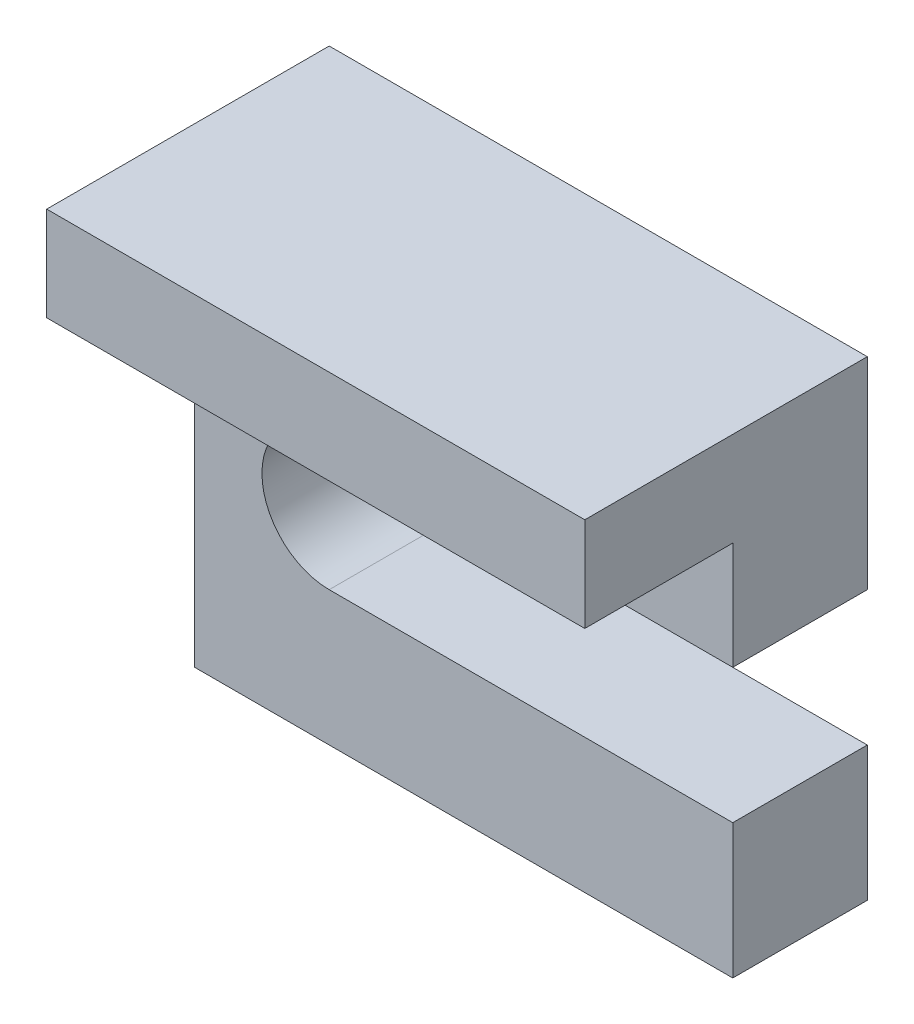
ISO-10303-21;
HEADER;
FILE_DESCRIPTION(('STEP AP214'),'2;1');
FILE_NAME('part.step','',(''),(''),'','','');
FILE_SCHEMA(('AUTOMOTIVE_DESIGN { 1 0 10303 214 1 1 1 1 }'));
ENDSEC;
DATA;
#1=APPLICATION_CONTEXT('core data for automotive mechanical design processes');
#2=APPLICATION_PROTOCOL_DEFINITION('international standard','automotive_design',2000,#1);
#3=PRODUCT_CONTEXT('',#1,'mechanical');
#4=PRODUCT('Part','Part','',(#3));
#5=PRODUCT_RELATED_PRODUCT_CATEGORY('part','',(#4));
#6=PRODUCT_DEFINITION_FORMATION('','',#4);
#7=PRODUCT_DEFINITION_CONTEXT('part definition',#1,'design');
#8=PRODUCT_DEFINITION('design','',#6,#7);
#9=PRODUCT_DEFINITION_SHAPE('','',#8);
#10=(LENGTH_UNIT() NAMED_UNIT(*) SI_UNIT(.MILLI.,.METRE.));
#11=(NAMED_UNIT(*) PLANE_ANGLE_UNIT() SI_UNIT($,.RADIAN.));
#12=(NAMED_UNIT(*) SI_UNIT($,.STERADIAN.) SOLID_ANGLE_UNIT());
#13=UNCERTAINTY_MEASURE_WITH_UNIT(LENGTH_MEASURE(1.E-05),#10,'distance_accuracy_value','');
#14=(GEOMETRIC_REPRESENTATION_CONTEXT(3) GLOBAL_UNCERTAINTY_ASSIGNED_CONTEXT((#13)) GLOBAL_UNIT_ASSIGNED_CONTEXT((#10,
#11,#12)) REPRESENTATION_CONTEXT('',''));
#15=CARTESIAN_POINT('',(0.,0.,0.));
#16=DIRECTION('',(0.,0.,1.));
#17=DIRECTION('',(1.,0.,0.));
#18=AXIS2_PLACEMENT_3D('',#15,#16,#17);
#19=CARTESIAN_POINT('',(-20.,17.5,-5.));
#20=DIRECTION('',(0.,0.,-1.));
#21=DIRECTION('',(0.,1.,0.));
#22=AXIS2_PLACEMENT_3D('',#19,#20,#21);
#23=PLANE('',#22);
#24=CARTESIAN_POINT('',(-10.,-2.5,-5.));
#25=DIRECTION('',(0.,0.,1.));
#26=DIRECTION('',(1.,0.,0.));
#27=AXIS2_PLACEMENT_3D('',#24,#25,#26);
#28=CIRCLE('',#27,5.);
#29=CARTESIAN_POINT('',(-10.,2.5,-5.));
#30=VERTEX_POINT('',#29);
#31=CARTESIAN_POINT('',(-10.,-7.5,-5.));
#32=VERTEX_POINT('',#31);
#33=EDGE_CURVE('E120',#30,#32,#28,.T.);
#34=ORIENTED_EDGE('',*,*,#33,.T.);
#35=DIRECTION('',(-1.,0.,0.));
#36=VECTOR('',#35,1.);
#37=CARTESIAN_POINT('',(0.,-7.5,-5.));
#38=LINE('',#37,#36);
#39=CARTESIAN_POINT('',(20.,-7.5,-5.));
#40=VERTEX_POINT('',#39);
#41=EDGE_CURVE('E112',#40,#32,#38,.T.);
#42=ORIENTED_EDGE('',*,*,#41,.F.);
#43=DIRECTION('',(0.,1.,0.));
#44=VECTOR('',#43,1.);
#45=CARTESIAN_POINT('',(20.,17.5,-5.));
#46=LINE('',#45,#44);
#47=CARTESIAN_POINT('',(20.,-17.5,-5.));
#48=VERTEX_POINT('',#47);
#49=EDGE_CURVE('E125',#48,#40,#46,.T.);
#50=ORIENTED_EDGE('',*,*,#49,.F.);
#51=DIRECTION('',(1.,0.,0.));
#52=VECTOR('',#51,1.);
#53=CARTESIAN_POINT('',(-20.,-17.5,-5.));
#54=LINE('',#53,#52);
#55=CARTESIAN_POINT('',(-20.,-17.5,-5.));
#56=VERTEX_POINT('',#55);
#57=EDGE_CURVE('E162',#56,#48,#54,.T.);
#58=ORIENTED_EDGE('',*,*,#57,.F.);
#59=DIRECTION('',(0.,1.,0.));
#60=VECTOR('',#59,1.);
#61=CARTESIAN_POINT('',(-20.,17.5,-5.));
#62=LINE('',#61,#60);
#63=CARTESIAN_POINT('',(-20.,17.5,-5.));
#64=VERTEX_POINT('',#63);
#65=EDGE_CURVE('E151',#56,#64,#62,.T.);
#66=ORIENTED_EDGE('',*,*,#65,.T.);
#67=DIRECTION('',(1.,0.,0.));
#68=VECTOR('',#67,1.);
#69=CARTESIAN_POINT('',(-20.,17.5,-5.));
#70=LINE('',#69,#68);
#71=CARTESIAN_POINT('',(20.,17.5,-5.));
#72=VERTEX_POINT('',#71);
#73=EDGE_CURVE('E159',#64,#72,#70,.T.);
#74=ORIENTED_EDGE('',*,*,#73,.T.);
#75=CARTESIAN_POINT('',(20.,2.5,-5.));
#76=VERTEX_POINT('',#75);
#77=EDGE_CURVE('E133',#76,#72,#46,.T.);
#78=ORIENTED_EDGE('',*,*,#77,.F.);
#79=DIRECTION('',(1.,0.,0.));
#80=VECTOR('',#79,1.);
#81=CARTESIAN_POINT('',(0.,2.5,-5.));
#82=LINE('',#81,#80);
#83=EDGE_CURVE('E48',#30,#76,#82,.T.);
#84=ORIENTED_EDGE('',*,*,#83,.F.);
#85=EDGE_LOOP('',(#34,#42,#50,#58,#66,#74,#78,#84));
#86=FACE_BOUND('',#85,.T.);
#87=ADVANCED_FACE('F33',(#86),#23,.T.);
#88=CARTESIAN_POINT('',(-20.,-17.5,5.));
#89=DIRECTION('',(0.,0.,1.));
#90=DIRECTION('',(1.,0.,0.));
#91=AXIS2_PLACEMENT_3D('',#88,#89,#90);
#92=PLANE('',#91);
#93=DIRECTION('',(0.,-1.,0.));
#94=VECTOR('',#93,1.);
#95=CARTESIAN_POINT('',(20.,-17.5,5.));
#96=LINE('',#95,#94);
#97=CARTESIAN_POINT('',(20.,-7.5,5.));
#98=VERTEX_POINT('',#97);
#99=CARTESIAN_POINT('',(20.,-17.5,5.));
#100=VERTEX_POINT('',#99);
#101=EDGE_CURVE('E179',#98,#100,#96,.T.);
#102=ORIENTED_EDGE('',*,*,#101,.F.);
#103=DIRECTION('',(-1.,0.,0.));
#104=VECTOR('',#103,1.);
#105=CARTESIAN_POINT('',(-20.,-7.50000000000001,5.));
#106=LINE('',#105,#104);
#107=CARTESIAN_POINT('',(-10.,-7.5,5.));
#108=VERTEX_POINT('',#107);
#109=EDGE_CURVE('E115',#98,#108,#106,.T.);
#110=ORIENTED_EDGE('',*,*,#109,.T.);
#111=CARTESIAN_POINT('',(-10.,-2.5,5.));
#112=DIRECTION('',(0.,0.,1.));
#113=DIRECTION('',(1.,0.,0.));
#114=AXIS2_PLACEMENT_3D('',#111,#112,#113);
#115=CIRCLE('',#114,5.);
#116=CARTESIAN_POINT('',(-10.,2.5,5.));
#117=VERTEX_POINT('',#116);
#118=EDGE_CURVE('E11',#117,#108,#115,.T.);
#119=ORIENTED_EDGE('',*,*,#118,.F.);
#120=DIRECTION('',(1.,0.,0.));
#121=VECTOR('',#120,1.);
#122=CARTESIAN_POINT('',(-20.,2.5,5.));
#123=LINE('',#122,#121);
#124=CARTESIAN_POINT('',(20.,2.49999999999999,5.));
#125=VERTEX_POINT('',#124);
#126=EDGE_CURVE('E184',#117,#125,#123,.T.);
#127=ORIENTED_EDGE('',*,*,#126,.T.);
#128=CARTESIAN_POINT('',(20.,10.5,5.));
#129=VERTEX_POINT('',#128);
#130=EDGE_CURVE('E187',#129,#125,#96,.T.);
#131=ORIENTED_EDGE('',*,*,#130,.F.);
#132=DIRECTION('',(1.,0.,0.));
#133=VECTOR('',#132,1.);
#134=CARTESIAN_POINT('',(-20.,10.5,5.));
#135=LINE('',#134,#133);
#136=CARTESIAN_POINT('',(-20.,10.5,5.));
#137=VERTEX_POINT('',#136);
#138=EDGE_CURVE('E167',#137,#129,#135,.T.);
#139=ORIENTED_EDGE('',*,*,#138,.F.);
#140=DIRECTION('',(0.,-1.,0.));
#141=VECTOR('',#140,1.);
#142=CARTESIAN_POINT('',(-20.,-17.5,5.));
#143=LINE('',#142,#141);
#144=CARTESIAN_POINT('',(-20.,-17.5,5.));
#145=VERTEX_POINT('',#144);
#146=EDGE_CURVE('E145',#137,#145,#143,.T.);
#147=ORIENTED_EDGE('',*,*,#146,.T.);
#148=DIRECTION('',(1.,0.,0.));
#149=VECTOR('',#148,1.);
#150=CARTESIAN_POINT('',(-20.,-17.5,5.));
#151=LINE('',#150,#149);
#152=EDGE_CURVE('E164',#145,#100,#151,.T.);
#153=ORIENTED_EDGE('',*,*,#152,.T.);
#154=EDGE_LOOP('',(#102,#110,#119,#127,#131,#139,#147,#153));
#155=FACE_BOUND('',#154,.T.);
#156=ADVANCED_FACE('F189',(#155),#92,.T.);
#157=CARTESIAN_POINT('',(20.,0.,0.));
#158=DIRECTION('',(-1.,0.,0.));
#159=DIRECTION('',(0.,0.,1.));
#160=AXIS2_PLACEMENT_3D('',#157,#158,#159);
#161=PLANE('',#160);
#162=DIRECTION('',(0.,0.,1.));
#163=VECTOR('',#162,1.);
#164=CARTESIAN_POINT('',(20.,-7.5,-5.));
#165=LINE('',#164,#163);
#166=EDGE_CURVE('E108',#40,#98,#165,.T.);
#167=ORIENTED_EDGE('',*,*,#166,.T.);
#168=ORIENTED_EDGE('',*,*,#101,.T.);
#169=DIRECTION('',(0.,0.,-1.));
#170=VECTOR('',#169,1.);
#171=CARTESIAN_POINT('',(20.,-17.5,-5.));
#172=LINE('',#171,#170);
#173=EDGE_CURVE('E131',#100,#48,#172,.T.);
#174=ORIENTED_EDGE('',*,*,#173,.T.);
#175=ORIENTED_EDGE('',*,*,#49,.T.);
#176=EDGE_LOOP('',(#167,#168,#174,#175));
#177=FACE_BOUND('',#176,.T.);
#178=ADVANCED_FACE('F129',(#177),#161,.F.);
#179=DIRECTION('',(0.,0.,1.));
#180=VECTOR('',#179,1.);
#181=CARTESIAN_POINT('',(20.,2.49999999999999,-5.));
#182=LINE('',#181,#180);
#183=EDGE_CURVE('E119',#76,#125,#182,.T.);
#184=ORIENTED_EDGE('',*,*,#183,.F.);
#185=ORIENTED_EDGE('',*,*,#77,.T.);
#186=DIRECTION('',(0.,0.,1.));
#187=VECTOR('',#186,1.);
#188=CARTESIAN_POINT('',(20.,17.5,16.));
#189=LINE('',#188,#187);
#190=CARTESIAN_POINT('',(20.,17.5,16.));
#191=VERTEX_POINT('',#190);
#192=EDGE_CURVE('E132',#72,#191,#189,.T.);
#193=ORIENTED_EDGE('',*,*,#192,.T.);
#194=DIRECTION('',(0.,-1.,0.));
#195=VECTOR('',#194,1.);
#196=CARTESIAN_POINT('',(20.,10.5,16.));
#197=LINE('',#196,#195);
#198=CARTESIAN_POINT('',(20.,10.5,16.));
#199=VERTEX_POINT('',#198);
#200=EDGE_CURVE('E170',#191,#199,#197,.T.);
#201=ORIENTED_EDGE('',*,*,#200,.T.);
#202=DIRECTION('',(0.,0.,-1.));
#203=VECTOR('',#202,1.);
#204=CARTESIAN_POINT('',(20.,10.5,5.));
#205=LINE('',#204,#203);
#206=EDGE_CURVE('E174',#199,#129,#205,.T.);
#207=ORIENTED_EDGE('',*,*,#206,.T.);
#208=ORIENTED_EDGE('',*,*,#130,.T.);
#209=EDGE_LOOP('',(#184,#185,#193,#201,#207,#208));
#210=FACE_BOUND('',#209,.T.);
#211=ADVANCED_FACE('F181',(#210),#161,.F.);
#212=CARTESIAN_POINT('',(-20.,10.5,16.));
#213=DIRECTION('',(0.,0.,1.));
#214=DIRECTION('',(1.,0.,0.));
#215=AXIS2_PLACEMENT_3D('',#212,#213,#214);
#216=PLANE('',#215);
#217=DIRECTION('',(1.,0.,0.));
#218=VECTOR('',#217,1.);
#219=CARTESIAN_POINT('',(-20.,10.5,16.));
#220=LINE('',#219,#218);
#221=CARTESIAN_POINT('',(-20.,10.5,16.));
#222=VERTEX_POINT('',#221);
#223=EDGE_CURVE('E157',#222,#199,#220,.T.);
#224=ORIENTED_EDGE('',*,*,#223,.T.);
#225=ORIENTED_EDGE('',*,*,#200,.F.);
#226=DIRECTION('',(1.,0.,0.));
#227=VECTOR('',#226,1.);
#228=CARTESIAN_POINT('',(-20.,17.5,16.));
#229=LINE('',#228,#227);
#230=CARTESIAN_POINT('',(-20.,17.5,16.));
#231=VERTEX_POINT('',#230);
#232=EDGE_CURVE('E41',#231,#191,#229,.T.);
#233=ORIENTED_EDGE('',*,*,#232,.F.);
#234=DIRECTION('',(0.,-1.,0.));
#235=VECTOR('',#234,1.);
#236=CARTESIAN_POINT('',(-20.,10.5,16.));
#237=LINE('',#236,#235);
#238=EDGE_CURVE('E136',#231,#222,#237,.T.);
#239=ORIENTED_EDGE('',*,*,#238,.T.);
#240=EDGE_LOOP('',(#224,#225,#233,#239));
#241=FACE_BOUND('',#240,.T.);
#242=ADVANCED_FACE('F35',(#241),#216,.T.);
#243=CARTESIAN_POINT('',(-20.,17.5,16.));
#244=DIRECTION('',(0.,1.,0.));
#245=DIRECTION('',(0.,0.,1.));
#246=AXIS2_PLACEMENT_3D('',#243,#244,#245);
#247=PLANE('',#246);
#248=ORIENTED_EDGE('',*,*,#232,.T.);
#249=ORIENTED_EDGE('',*,*,#192,.F.);
#250=ORIENTED_EDGE('',*,*,#73,.F.);
#251=DIRECTION('',(0.,0.,1.));
#252=VECTOR('',#251,1.);
#253=CARTESIAN_POINT('',(-20.,17.5,16.));
#254=LINE('',#253,#252);
#255=EDGE_CURVE('E154',#64,#231,#254,.T.);
#256=ORIENTED_EDGE('',*,*,#255,.T.);
#257=EDGE_LOOP('',(#248,#249,#250,#256));
#258=FACE_BOUND('',#257,.T.);
#259=ADVANCED_FACE('F199',(#258),#247,.T.);
#260=CARTESIAN_POINT('',(-20.,-17.5,-5.));
#261=DIRECTION('',(0.,-1.,0.));
#262=DIRECTION('',(0.,0.,-1.));
#263=AXIS2_PLACEMENT_3D('',#260,#261,#262);
#264=PLANE('',#263);
#265=ORIENTED_EDGE('',*,*,#57,.T.);
#266=ORIENTED_EDGE('',*,*,#173,.F.);
#267=ORIENTED_EDGE('',*,*,#152,.F.);
#268=DIRECTION('',(0.,0.,-1.));
#269=VECTOR('',#268,1.);
#270=CARTESIAN_POINT('',(-20.,-17.5,-5.));
#271=LINE('',#270,#269);
#272=EDGE_CURVE('E148',#145,#56,#271,.T.);
#273=ORIENTED_EDGE('',*,*,#272,.T.);
#274=EDGE_LOOP('',(#265,#266,#267,#273));
#275=FACE_BOUND('',#274,.T.);
#276=ADVANCED_FACE('F193',(#275),#264,.T.);
#277=CARTESIAN_POINT('',(-20.,10.5,5.));
#278=DIRECTION('',(0.,-1.,0.));
#279=DIRECTION('',(0.,0.,-1.));
#280=AXIS2_PLACEMENT_3D('',#277,#278,#279);
#281=PLANE('',#280);
#282=ORIENTED_EDGE('',*,*,#138,.T.);
#283=ORIENTED_EDGE('',*,*,#206,.F.);
#284=ORIENTED_EDGE('',*,*,#223,.F.);
#285=DIRECTION('',(0.,0.,-1.));
#286=VECTOR('',#285,1.);
#287=CARTESIAN_POINT('',(-20.,10.5,5.));
#288=LINE('',#287,#286);
#289=EDGE_CURVE('E142',#222,#137,#288,.T.);
#290=ORIENTED_EDGE('',*,*,#289,.T.);
#291=EDGE_LOOP('',(#282,#283,#284,#290));
#292=FACE_BOUND('',#291,.T.);
#293=ADVANCED_FACE('F175',(#292),#281,.T.);
#294=CARTESIAN_POINT('',(-20.,0.,0.));
#295=DIRECTION('',(-1.,0.,0.));
#296=DIRECTION('',(0.,0.,1.));
#297=AXIS2_PLACEMENT_3D('',#294,#295,#296);
#298=PLANE('',#297);
#299=ORIENTED_EDGE('',*,*,#238,.F.);
#300=ORIENTED_EDGE('',*,*,#255,.F.);
#301=ORIENTED_EDGE('',*,*,#65,.F.);
#302=ORIENTED_EDGE('',*,*,#272,.F.);
#303=ORIENTED_EDGE('',*,*,#146,.F.);
#304=ORIENTED_EDGE('',*,*,#289,.F.);
#305=EDGE_LOOP('',(#299,#300,#301,#302,#303,#304));
#306=FACE_BOUND('',#305,.T.);
#307=ADVANCED_FACE('F197',(#306),#298,.T.);
#308=CARTESIAN_POINT('',(0.,-7.5,-5.));
#309=DIRECTION('',(0.,1.,0.));
#310=DIRECTION('',(-1.,0.,0.));
#311=AXIS2_PLACEMENT_3D('',#308,#309,#310);
#312=PLANE('',#311);
#313=ORIENTED_EDGE('',*,*,#166,.F.);
#314=ORIENTED_EDGE('',*,*,#41,.T.);
#315=DIRECTION('',(0.,0.,1.));
#316=VECTOR('',#315,1.);
#317=CARTESIAN_POINT('',(-10.,-7.5,-5.));
#318=LINE('',#317,#316);
#319=EDGE_CURVE('E205',#32,#108,#318,.T.);
#320=ORIENTED_EDGE('',*,*,#319,.T.);
#321=ORIENTED_EDGE('',*,*,#109,.F.);
#322=EDGE_LOOP('',(#313,#314,#320,#321));
#323=FACE_BOUND('',#322,.T.);
#324=ADVANCED_FACE('F110',(#323),#312,.T.);
#325=CARTESIAN_POINT('',(-10.,-2.5,-5.));
#326=DIRECTION('',(0.,0.,1.));
#327=DIRECTION('',(1.,0.,0.));
#328=AXIS2_PLACEMENT_3D('',#325,#326,#327);
#329=CYLINDRICAL_SURFACE('',#328,5.);
#330=ORIENTED_EDGE('',*,*,#118,.T.);
#331=ORIENTED_EDGE('',*,*,#319,.F.);
#332=ORIENTED_EDGE('',*,*,#33,.F.);
#333=DIRECTION('',(0.,0.,1.));
#334=VECTOR('',#333,1.);
#335=CARTESIAN_POINT('',(-10.,2.5,-5.));
#336=LINE('',#335,#334);
#337=EDGE_CURVE('E202',#30,#117,#336,.T.);
#338=ORIENTED_EDGE('',*,*,#337,.T.);
#339=EDGE_LOOP('',(#330,#331,#332,#338));
#340=FACE_BOUND('',#339,.T.);
#341=ADVANCED_FACE('F212',(#340),#329,.F.);
#342=CARTESIAN_POINT('',(0.,2.5,-5.));
#343=DIRECTION('',(0.,-1.,0.));
#344=DIRECTION('',(1.,0.,0.));
#345=AXIS2_PLACEMENT_3D('',#342,#343,#344);
#346=PLANE('',#345);
#347=ORIENTED_EDGE('',*,*,#337,.F.);
#348=ORIENTED_EDGE('',*,*,#83,.T.);
#349=ORIENTED_EDGE('',*,*,#183,.T.);
#350=ORIENTED_EDGE('',*,*,#126,.F.);
#351=EDGE_LOOP('',(#347,#348,#349,#350));
#352=FACE_BOUND('',#351,.T.);
#353=ADVANCED_FACE('F213',(#352),#346,.T.);
#354=CLOSED_SHELL('',(#87,#156,#178,#211,#242,#259,#276,#293,#307,#324,#341,#353));
#355=MANIFOLD_SOLID_BREP('B2',#354);
#356=ADVANCED_BREP_SHAPE_REPRESENTATION('',(#18,#355),#14);
#357=SHAPE_DEFINITION_REPRESENTATION(#9,#356);
ENDSEC;
END-ISO-10303-21;
